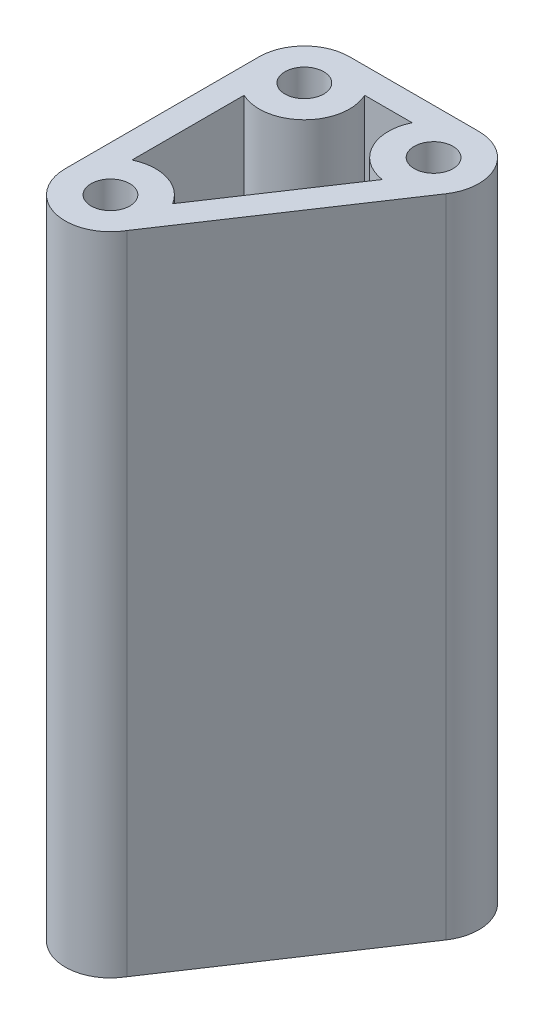
ISO-10303-21;
HEADER;
FILE_DESCRIPTION(('STEP AP214'),'2;1');
FILE_NAME('part.step','',(''),(''),'','','');
FILE_SCHEMA(('AUTOMOTIVE_DESIGN { 1 0 10303 214 1 1 1 1 }'));
ENDSEC;
DATA;
#1=APPLICATION_CONTEXT('core data for automotive mechanical design processes');
#2=APPLICATION_PROTOCOL_DEFINITION('international standard','automotive_design',2000,#1);
#3=PRODUCT_CONTEXT('',#1,'mechanical');
#4=PRODUCT('Part','Part','',(#3));
#5=PRODUCT_RELATED_PRODUCT_CATEGORY('part','',(#4));
#6=PRODUCT_DEFINITION_FORMATION('','',#4);
#7=PRODUCT_DEFINITION_CONTEXT('part definition',#1,'design');
#8=PRODUCT_DEFINITION('design','',#6,#7);
#9=PRODUCT_DEFINITION_SHAPE('','',#8);
#10=(LENGTH_UNIT() NAMED_UNIT(*) SI_UNIT(.MILLI.,.METRE.));
#11=(NAMED_UNIT(*) PLANE_ANGLE_UNIT() SI_UNIT($,.RADIAN.));
#12=(NAMED_UNIT(*) SI_UNIT($,.STERADIAN.) SOLID_ANGLE_UNIT());
#13=UNCERTAINTY_MEASURE_WITH_UNIT(LENGTH_MEASURE(1.E-05),#10,'distance_accuracy_value','');
#14=(GEOMETRIC_REPRESENTATION_CONTEXT(3) GLOBAL_UNCERTAINTY_ASSIGNED_CONTEXT((#13)) GLOBAL_UNIT_ASSIGNED_CONTEXT((#10,
#11,#12)) REPRESENTATION_CONTEXT('',''));
#15=CARTESIAN_POINT('',(0.,0.,0.));
#16=DIRECTION('',(0.,0.,1.));
#17=DIRECTION('',(1.,0.,0.));
#18=AXIS2_PLACEMENT_3D('',#15,#16,#17);
#19=CARTESIAN_POINT('',(-7.73602805423243,50.,-16.5521413639528));
#20=DIRECTION('',(0.,1.,0.));
#21=DIRECTION('',(0.,0.,1.));
#22=AXIS2_PLACEMENT_3D('',#19,#20,#21);
#23=PLANE('',#22);
#24=DIRECTION('',(0.,0.,1.));
#25=VECTOR('',#24,1.);
#26=CARTESIAN_POINT('',(-9.23602805423243,50.,-16.5521413639528));
#27=LINE('',#26,#25);
#28=CARTESIAN_POINT('',(-9.23602805423243,50.,-13.3898637037844));
#29=VERTEX_POINT('',#28);
#30=CARTESIAN_POINT('',(-9.23602805423243,50.,-4.71441902412118));
#31=VERTEX_POINT('',#30);
#32=EDGE_CURVE('E158',#29,#31,#27,.T.);
#33=ORIENTED_EDGE('',*,*,#32,.F.);
#34=CARTESIAN_POINT('',(-7.73602805423243,50.,-16.5521413639528));
#35=DIRECTION('',(0.,1.,0.));
#36=DIRECTION('',(0.,0.,1.));
#37=AXIS2_PLACEMENT_3D('',#34,#35,#36);
#38=CIRCLE('',#37,3.5);
#39=CARTESIAN_POINT('',(-4.57375039406405,50.,-18.0521413639528));
#40=VERTEX_POINT('',#39);
#41=EDGE_CURVE('E131',#29,#40,#38,.T.);
#42=ORIENTED_EDGE('',*,*,#41,.T.);
#43=DIRECTION('',(-1.,0.,0.));
#44=VECTOR('',#43,1.);
#45=CARTESIAN_POINT('',(-7.73602805423243,50.,-18.0521413639528));
#46=LINE('',#45,#44);
#47=CARTESIAN_POINT('',(-0.898305714400813,50.,-18.0521413639528));
#48=VERTEX_POINT('',#47);
#49=EDGE_CURVE('E58',#48,#40,#46,.T.);
#50=ORIENTED_EDGE('',*,*,#49,.F.);
#51=CARTESIAN_POINT('',(2.26397194576757,50.,-16.5521413639528));
#52=DIRECTION('',(0.,1.,0.));
#53=DIRECTION('',(0.,0.,1.));
#54=AXIS2_PLACEMENT_3D('',#51,#52,#53);
#55=CIRCLE('',#54,3.5);
#56=CARTESIAN_POINT('',(1.75650332997861,50.,-13.0891259721318));
#57=VERTEX_POINT('',#56);
#58=EDGE_CURVE('E165',#48,#57,#55,.T.);
#59=ORIENTED_EDGE('',*,*,#58,.T.);
#60=DIRECTION('',(0.555038453085446,0.,-0.831824690422517));
#61=VECTOR('',#60,1.);
#62=CARTESIAN_POINT('',(-6.36858852183192,50.,-0.912218270123703));
#63=LINE('',#62,#61);
#64=CARTESIAN_POINT('',(-4.73728886099812,50.,-3.35701345109927));
#65=VERTEX_POINT('',#64);
#66=EDGE_CURVE('E160',#65,#57,#63,.T.);
#67=ORIENTED_EDGE('',*,*,#66,.F.);
#68=CARTESIAN_POINT('',(-7.73602805423243,50.,-1.5521413639528));
#69=DIRECTION('',(0.,1.,0.));
#70=DIRECTION('',(0.,0.,1.));
#71=AXIS2_PLACEMENT_3D('',#68,#69,#70);
#72=CIRCLE('',#71,3.5);
#73=EDGE_CURVE('E157',#65,#31,#72,.T.);
#74=ORIENTED_EDGE('',*,*,#73,.T.);
#75=EDGE_LOOP('',(#33,#42,#50,#59,#67,#74));
#76=FACE_BOUND('',#75,.T.);
#77=CARTESIAN_POINT('',(2.26397194576757,50.,-16.5521413639528));
#78=DIRECTION('',(0.,1.,0.));
#79=DIRECTION('',(0.,0.,1.));
#80=AXIS2_PLACEMENT_3D('',#77,#78,#79);
#81=CIRCLE('',#80,1.5);
#82=CARTESIAN_POINT('',(2.26397194576757,50.,-15.0521413639528));
#83=VERTEX_POINT('',#82);
#84=EDGE_CURVE('E184',#83,#83,#81,.T.);
#85=ORIENTED_EDGE('',*,*,#84,.F.);
#86=EDGE_LOOP('',(#85));
#87=FACE_BOUND('',#86,.T.);
#88=CARTESIAN_POINT('',(-7.73602805423243,50.,-16.5521413639528));
#89=DIRECTION('',(0.,1.,0.));
#90=DIRECTION('',(0.,0.,1.));
#91=AXIS2_PLACEMENT_3D('',#88,#89,#90);
#92=CIRCLE('',#91,3.5);
#93=CARTESIAN_POINT('',(-7.73602805423243,50.,-20.0521413639528));
#94=VERTEX_POINT('',#93);
#95=CARTESIAN_POINT('',(-11.2360280542324,50.,-16.5521413639528));
#96=VERTEX_POINT('',#95);
#97=EDGE_CURVE('E196',#94,#96,#92,.T.);
#98=ORIENTED_EDGE('',*,*,#97,.T.);
#99=DIRECTION('',(0.,0.,1.));
#100=VECTOR('',#99,1.);
#101=CARTESIAN_POINT('',(-11.2360280542324,50.,-16.5521413639528));
#102=LINE('',#101,#100);
#103=CARTESIAN_POINT('',(-11.2360280542324,50.,-1.5521413639528));
#104=VERTEX_POINT('',#103);
#105=EDGE_CURVE('E199',#96,#104,#102,.T.);
#106=ORIENTED_EDGE('',*,*,#105,.T.);
#107=CARTESIAN_POINT('',(-7.73602805423243,50.,-1.5521413639528));
#108=DIRECTION('',(0.,1.,0.));
#109=DIRECTION('',(0.,0.,1.));
#110=AXIS2_PLACEMENT_3D('',#107,#108,#109);
#111=CIRCLE('',#110,3.5);
#112=CARTESIAN_POINT('',(-4.70493914098689,50.,0.197858636047188));
#113=VERTEX_POINT('',#112);
#114=EDGE_CURVE('E202',#104,#113,#111,.T.);
#115=ORIENTED_EDGE('',*,*,#114,.T.);
#116=DIRECTION('',(0.555038453085445,0.,-0.831824690422517));
#117=VECTOR('',#116,1.);
#118=CARTESIAN_POINT('',(-4.70493914098689,50.,0.197858636047188));
#119=LINE('',#118,#117);
#120=CARTESIAN_POINT('',(5.16907528644452,50.,-14.6001232851463));
#121=VERTEX_POINT('',#120);
#122=EDGE_CURVE('E204',#113,#121,#119,.T.);
#123=ORIENTED_EDGE('',*,*,#122,.T.);
#124=CARTESIAN_POINT('',(2.26397194576757,50.,-16.5521413639528));
#125=DIRECTION('',(0.,1.,0.));
#126=DIRECTION('',(0.,0.,1.));
#127=AXIS2_PLACEMENT_3D('',#124,#125,#126);
#128=CIRCLE('',#127,3.5);
#129=CARTESIAN_POINT('',(2.26397194576757,50.,-20.0521413639528));
#130=VERTEX_POINT('',#129);
#131=EDGE_CURVE('E206',#121,#130,#128,.T.);
#132=ORIENTED_EDGE('',*,*,#131,.T.);
#133=DIRECTION('',(-1.,0.,0.));
#134=VECTOR('',#133,1.);
#135=CARTESIAN_POINT('',(-7.73602805423243,50.,-20.0521413639528));
#136=LINE('',#135,#134);
#137=EDGE_CURVE('E208',#130,#94,#136,.T.);
#138=ORIENTED_EDGE('',*,*,#137,.T.);
#139=EDGE_LOOP('',(#98,#106,#115,#123,#132,#138));
#140=FACE_BOUND('',#139,.T.);
#141=CARTESIAN_POINT('',(-7.73602805423243,50.,-16.5521413639528));
#142=DIRECTION('',(0.,1.,0.));
#143=DIRECTION('',(0.,0.,1.));
#144=AXIS2_PLACEMENT_3D('',#141,#142,#143);
#145=CIRCLE('',#144,1.5);
#146=CARTESIAN_POINT('',(-7.73602805423243,50.,-15.0521413639528));
#147=VERTEX_POINT('',#146);
#148=EDGE_CURVE('E190',#147,#147,#145,.T.);
#149=ORIENTED_EDGE('',*,*,#148,.F.);
#150=EDGE_LOOP('',(#149));
#151=FACE_BOUND('',#150,.T.);
#152=CARTESIAN_POINT('',(-7.73602805423243,50.,-1.5521413639528));
#153=DIRECTION('',(0.,1.,0.));
#154=DIRECTION('',(0.,0.,1.));
#155=AXIS2_PLACEMENT_3D('',#152,#153,#154);
#156=CIRCLE('',#155,1.5);
#157=CARTESIAN_POINT('',(-7.73602805423243,50.,-0.0521413639528044));
#158=VERTEX_POINT('',#157);
#159=EDGE_CURVE('E178',#158,#158,#156,.T.);
#160=ORIENTED_EDGE('',*,*,#159,.F.);
#161=EDGE_LOOP('',(#160));
#162=FACE_BOUND('',#161,.T.);
#163=ADVANCED_FACE('F35',(#76,#87,#140,#151,#162),#23,.T.);
#164=CARTESIAN_POINT('',(-7.73602805423243,0.,-16.5521413639528));
#165=DIRECTION('',(0.,1.,0.));
#166=DIRECTION('',(0.,0.,1.));
#167=AXIS2_PLACEMENT_3D('',#164,#165,#166);
#168=PLANE('',#167);
#169=DIRECTION('',(-1.,0.,0.));
#170=VECTOR('',#169,1.);
#171=CARTESIAN_POINT('',(-4.57375039406405,0.,-18.0521413639528));
#172=LINE('',#171,#170);
#173=CARTESIAN_POINT('',(-0.898305714400811,0.,-18.0521413639528));
#174=VERTEX_POINT('',#173);
#175=CARTESIAN_POINT('',(-4.57375039406405,0.,-18.0521413639528));
#176=VERTEX_POINT('',#175);
#177=EDGE_CURVE('E147',#174,#176,#172,.T.);
#178=ORIENTED_EDGE('',*,*,#177,.T.);
#179=CARTESIAN_POINT('',(-7.73602805423243,0.,-16.5521413639528));
#180=DIRECTION('',(0.,-1.,0.));
#181=DIRECTION('',(0.,0.,-1.));
#182=AXIS2_PLACEMENT_3D('',#179,#180,#181);
#183=CIRCLE('',#182,3.5);
#184=CARTESIAN_POINT('',(-9.23602805423243,0.,-13.3898637037844));
#185=VERTEX_POINT('',#184);
#186=EDGE_CURVE('E128',#176,#185,#183,.T.);
#187=ORIENTED_EDGE('',*,*,#186,.T.);
#188=DIRECTION('',(0.,0.,1.));
#189=VECTOR('',#188,1.);
#190=CARTESIAN_POINT('',(-9.23602805423243,0.,-13.3898637037844));
#191=LINE('',#190,#189);
#192=CARTESIAN_POINT('',(-9.23602805423243,0.,-4.71441902412118));
#193=VERTEX_POINT('',#192);
#194=EDGE_CURVE('E137',#185,#193,#191,.T.);
#195=ORIENTED_EDGE('',*,*,#194,.T.);
#196=CARTESIAN_POINT('',(-7.73602805423243,0.,-1.5521413639528));
#197=DIRECTION('',(0.,-1.,0.));
#198=DIRECTION('',(0.,0.,-1.));
#199=AXIS2_PLACEMENT_3D('',#196,#197,#198);
#200=CIRCLE('',#199,3.5);
#201=CARTESIAN_POINT('',(-4.73728886099812,0.,-3.35701345109928));
#202=VERTEX_POINT('',#201);
#203=EDGE_CURVE('E141',#193,#202,#200,.T.);
#204=ORIENTED_EDGE('',*,*,#203,.T.);
#205=DIRECTION('',(0.555038453085445,0.,-0.831824690422517));
#206=VECTOR('',#205,1.);
#207=CARTESIAN_POINT('',(-4.73728886099812,0.,-3.35701345109927));
#208=LINE('',#207,#206);
#209=CARTESIAN_POINT('',(1.75650332997861,0.,-13.0891259721318));
#210=VERTEX_POINT('',#209);
#211=EDGE_CURVE('E151',#202,#210,#208,.T.);
#212=ORIENTED_EDGE('',*,*,#211,.T.);
#213=CARTESIAN_POINT('',(2.26397194576757,0.,-16.5521413639528));
#214=DIRECTION('',(0.,-1.,0.));
#215=DIRECTION('',(0.,0.,1.));
#216=AXIS2_PLACEMENT_3D('',#213,#214,#215);
#217=CIRCLE('',#216,3.5);
#218=EDGE_CURVE('E154',#210,#174,#217,.T.);
#219=ORIENTED_EDGE('',*,*,#218,.T.);
#220=EDGE_LOOP('',(#178,#187,#195,#204,#212,#219));
#221=FACE_BOUND('',#220,.T.);
#222=CARTESIAN_POINT('',(-7.73602805423243,0.,-16.5521413639528));
#223=DIRECTION('',(0.,1.,0.));
#224=DIRECTION('',(0.,0.,1.));
#225=AXIS2_PLACEMENT_3D('',#222,#223,#224);
#226=CIRCLE('',#225,3.5);
#227=CARTESIAN_POINT('',(-7.73602805423243,0.,-20.0521413639528));
#228=VERTEX_POINT('',#227);
#229=CARTESIAN_POINT('',(-11.2360280542324,0.,-16.5521413639528));
#230=VERTEX_POINT('',#229);
#231=EDGE_CURVE('E193',#228,#230,#226,.T.);
#232=ORIENTED_EDGE('',*,*,#231,.F.);
#233=DIRECTION('',(-1.,0.,0.));
#234=VECTOR('',#233,1.);
#235=CARTESIAN_POINT('',(-7.73602805423243,0.,-20.0521413639528));
#236=LINE('',#235,#234);
#237=CARTESIAN_POINT('',(2.26397194576757,0.,-20.0521413639528));
#238=VERTEX_POINT('',#237);
#239=EDGE_CURVE('E200',#238,#228,#236,.T.);
#240=ORIENTED_EDGE('',*,*,#239,.F.);
#241=CARTESIAN_POINT('',(2.26397194576757,0.,-16.5521413639528));
#242=DIRECTION('',(0.,1.,0.));
#243=DIRECTION('',(0.,0.,1.));
#244=AXIS2_PLACEMENT_3D('',#241,#242,#243);
#245=CIRCLE('',#244,3.5);
#246=CARTESIAN_POINT('',(5.16907528644452,0.,-14.6001232851463));
#247=VERTEX_POINT('',#246);
#248=EDGE_CURVE('E219',#247,#238,#245,.T.);
#249=ORIENTED_EDGE('',*,*,#248,.F.);
#250=DIRECTION('',(0.555038453085445,0.,-0.831824690422517));
#251=VECTOR('',#250,1.);
#252=CARTESIAN_POINT('',(-4.70493914098689,0.,0.197858636047188));
#253=LINE('',#252,#251);
#254=CARTESIAN_POINT('',(-4.70493914098689,0.,0.197858636047188));
#255=VERTEX_POINT('',#254);
#256=EDGE_CURVE('E217',#255,#247,#253,.T.);
#257=ORIENTED_EDGE('',*,*,#256,.F.);
#258=CARTESIAN_POINT('',(-7.73602805423243,0.,-1.5521413639528));
#259=DIRECTION('',(0.,1.,0.));
#260=DIRECTION('',(0.,0.,1.));
#261=AXIS2_PLACEMENT_3D('',#258,#259,#260);
#262=CIRCLE('',#261,3.5);
#263=CARTESIAN_POINT('',(-11.2360280542324,0.,-1.5521413639528));
#264=VERTEX_POINT('',#263);
#265=EDGE_CURVE('E215',#264,#255,#262,.T.);
#266=ORIENTED_EDGE('',*,*,#265,.F.);
#267=DIRECTION('',(0.,0.,1.));
#268=VECTOR('',#267,1.);
#269=CARTESIAN_POINT('',(-11.2360280542324,0.,-16.5521413639528));
#270=LINE('',#269,#268);
#271=EDGE_CURVE('E213',#230,#264,#270,.T.);
#272=ORIENTED_EDGE('',*,*,#271,.F.);
#273=EDGE_LOOP('',(#232,#240,#249,#257,#266,#272));
#274=FACE_BOUND('',#273,.T.);
#275=CARTESIAN_POINT('',(-7.73602805423243,0.,-16.5521413639528));
#276=DIRECTION('',(0.,1.,0.));
#277=DIRECTION('',(0.,0.,1.));
#278=AXIS2_PLACEMENT_3D('',#275,#276,#277);
#279=CIRCLE('',#278,1.5);
#280=CARTESIAN_POINT('',(-7.73602805423243,0.,-15.0521413639528));
#281=VERTEX_POINT('',#280);
#282=EDGE_CURVE('E187',#281,#281,#279,.T.);
#283=ORIENTED_EDGE('',*,*,#282,.T.);
#284=EDGE_LOOP('',(#283));
#285=FACE_BOUND('',#284,.T.);
#286=CARTESIAN_POINT('',(2.26397194576757,0.,-16.5521413639528));
#287=DIRECTION('',(0.,1.,0.));
#288=DIRECTION('',(0.,0.,1.));
#289=AXIS2_PLACEMENT_3D('',#286,#287,#288);
#290=CIRCLE('',#289,1.5);
#291=CARTESIAN_POINT('',(2.26397194576757,0.,-15.0521413639528));
#292=VERTEX_POINT('',#291);
#293=EDGE_CURVE('E181',#292,#292,#290,.T.);
#294=ORIENTED_EDGE('',*,*,#293,.T.);
#295=EDGE_LOOP('',(#294));
#296=FACE_BOUND('',#295,.T.);
#297=CARTESIAN_POINT('',(-7.73602805423243,0.,-1.5521413639528));
#298=DIRECTION('',(0.,1.,0.));
#299=DIRECTION('',(0.,0.,1.));
#300=AXIS2_PLACEMENT_3D('',#297,#298,#299);
#301=CIRCLE('',#300,1.5);
#302=CARTESIAN_POINT('',(-7.73602805423243,0.,-0.0521413639528044));
#303=VERTEX_POINT('',#302);
#304=EDGE_CURVE('E177',#303,#303,#301,.T.);
#305=ORIENTED_EDGE('',*,*,#304,.T.);
#306=EDGE_LOOP('',(#305));
#307=FACE_BOUND('',#306,.T.);
#308=ADVANCED_FACE('F143',(#221,#274,#285,#296,#307),#168,.F.);
#309=CARTESIAN_POINT('',(-7.73602805423243,50.,-16.5521413639528));
#310=DIRECTION('',(0.,-1.,0.));
#311=DIRECTION('',(0.,0.,-1.));
#312=AXIS2_PLACEMENT_3D('',#309,#310,#311);
#313=CYLINDRICAL_SURFACE('',#312,3.5);
#314=ORIENTED_EDGE('',*,*,#231,.T.);
#315=DIRECTION('',(0.,-1.,0.));
#316=VECTOR('',#315,1.);
#317=CARTESIAN_POINT('',(-11.2360280542324,50.,-16.5521413639528));
#318=LINE('',#317,#316);
#319=EDGE_CURVE('E11',#96,#230,#318,.T.);
#320=ORIENTED_EDGE('',*,*,#319,.F.);
#321=ORIENTED_EDGE('',*,*,#97,.F.);
#322=DIRECTION('',(0.,-1.,0.));
#323=VECTOR('',#322,1.);
#324=CARTESIAN_POINT('',(-7.73602805423243,50.,-20.0521413639528));
#325=LINE('',#324,#323);
#326=EDGE_CURVE('E210',#94,#228,#325,.T.);
#327=ORIENTED_EDGE('',*,*,#326,.T.);
#328=EDGE_LOOP('',(#314,#320,#321,#327));
#329=FACE_BOUND('',#328,.T.);
#330=ADVANCED_FACE('F37',(#329),#313,.T.);
#331=CARTESIAN_POINT('',(-11.2360280542324,50.,-16.5521413639528));
#332=DIRECTION('',(1.,0.,0.));
#333=DIRECTION('',(0.,0.,-1.));
#334=AXIS2_PLACEMENT_3D('',#331,#332,#333);
#335=PLANE('',#334);
#336=ORIENTED_EDGE('',*,*,#271,.T.);
#337=DIRECTION('',(0.,-1.,0.));
#338=VECTOR('',#337,1.);
#339=CARTESIAN_POINT('',(-11.2360280542324,50.,-1.5521413639528));
#340=LINE('',#339,#338);
#341=EDGE_CURVE('E43',#104,#264,#340,.T.);
#342=ORIENTED_EDGE('',*,*,#341,.F.);
#343=ORIENTED_EDGE('',*,*,#105,.F.);
#344=ORIENTED_EDGE('',*,*,#319,.T.);
#345=EDGE_LOOP('',(#336,#342,#343,#344));
#346=FACE_BOUND('',#345,.T.);
#347=ADVANCED_FACE('F259',(#346),#335,.F.);
#348=CARTESIAN_POINT('',(-7.73602805423243,50.,-1.5521413639528));
#349=DIRECTION('',(0.,-1.,0.));
#350=DIRECTION('',(0.,0.,-1.));
#351=AXIS2_PLACEMENT_3D('',#348,#349,#350);
#352=CYLINDRICAL_SURFACE('',#351,3.5);
#353=ORIENTED_EDGE('',*,*,#265,.T.);
#354=DIRECTION('',(0.,-1.,0.));
#355=VECTOR('',#354,1.);
#356=CARTESIAN_POINT('',(-4.70493914098689,50.,0.197858636047188));
#357=LINE('',#356,#355);
#358=EDGE_CURVE('E230',#113,#255,#357,.T.);
#359=ORIENTED_EDGE('',*,*,#358,.F.);
#360=ORIENTED_EDGE('',*,*,#114,.F.);
#361=ORIENTED_EDGE('',*,*,#341,.T.);
#362=EDGE_LOOP('',(#353,#359,#360,#361));
#363=FACE_BOUND('',#362,.T.);
#364=ADVANCED_FACE('F237',(#363),#352,.T.);
#365=CARTESIAN_POINT('',(-4.70493914098689,50.,0.197858636047188));
#366=DIRECTION('',(-0.831824690422517,0.,-0.555038453085446));
#367=DIRECTION('',(-0.555038453085446,0.,0.831824690422517));
#368=AXIS2_PLACEMENT_3D('',#365,#366,#367);
#369=PLANE('',#368);
#370=ORIENTED_EDGE('',*,*,#256,.T.);
#371=DIRECTION('',(0.,-1.,0.));
#372=VECTOR('',#371,1.);
#373=CARTESIAN_POINT('',(5.16907528644452,50.,-14.6001232851463));
#374=LINE('',#373,#372);
#375=EDGE_CURVE('E227',#121,#247,#374,.T.);
#376=ORIENTED_EDGE('',*,*,#375,.F.);
#377=ORIENTED_EDGE('',*,*,#122,.F.);
#378=ORIENTED_EDGE('',*,*,#358,.T.);
#379=EDGE_LOOP('',(#370,#376,#377,#378));
#380=FACE_BOUND('',#379,.T.);
#381=ADVANCED_FACE('F247',(#380),#369,.F.);
#382=CARTESIAN_POINT('',(2.26397194576757,50.,-16.5521413639528));
#383=DIRECTION('',(0.,-1.,0.));
#384=DIRECTION('',(0.,0.,-1.));
#385=AXIS2_PLACEMENT_3D('',#382,#383,#384);
#386=CYLINDRICAL_SURFACE('',#385,3.5);
#387=ORIENTED_EDGE('',*,*,#248,.T.);
#388=DIRECTION('',(0.,-1.,0.));
#389=VECTOR('',#388,1.);
#390=CARTESIAN_POINT('',(2.26397194576757,50.,-20.0521413639528));
#391=LINE('',#390,#389);
#392=EDGE_CURVE('E224',#130,#238,#391,.T.);
#393=ORIENTED_EDGE('',*,*,#392,.F.);
#394=ORIENTED_EDGE('',*,*,#131,.F.);
#395=ORIENTED_EDGE('',*,*,#375,.T.);
#396=EDGE_LOOP('',(#387,#393,#394,#395));
#397=FACE_BOUND('',#396,.T.);
#398=ADVANCED_FACE('F251',(#397),#386,.T.);
#399=CARTESIAN_POINT('',(-7.73602805423243,50.,-20.0521413639528));
#400=DIRECTION('',(0.,0.,1.));
#401=DIRECTION('',(1.,0.,0.));
#402=AXIS2_PLACEMENT_3D('',#399,#400,#401);
#403=PLANE('',#402);
#404=ORIENTED_EDGE('',*,*,#239,.T.);
#405=ORIENTED_EDGE('',*,*,#326,.F.);
#406=ORIENTED_EDGE('',*,*,#137,.F.);
#407=ORIENTED_EDGE('',*,*,#392,.T.);
#408=EDGE_LOOP('',(#404,#405,#406,#407));
#409=FACE_BOUND('',#408,.T.);
#410=ADVANCED_FACE('F262',(#409),#403,.F.);
#411=CARTESIAN_POINT('',(-7.73602805423243,50.,-16.5521413639528));
#412=DIRECTION('',(0.,-1.,0.));
#413=DIRECTION('',(0.,0.,-1.));
#414=AXIS2_PLACEMENT_3D('',#411,#412,#413);
#415=CYLINDRICAL_SURFACE('',#414,1.5);
#416=ORIENTED_EDGE('',*,*,#148,.T.);
#417=EDGE_LOOP('',(#416));
#418=FACE_BOUND('',#417,.T.);
#419=ORIENTED_EDGE('',*,*,#282,.F.);
#420=EDGE_LOOP('',(#419));
#421=FACE_BOUND('',#420,.T.);
#422=ADVANCED_FACE('F264',(#418,#421),#415,.F.);
#423=CARTESIAN_POINT('',(2.26397194576757,50.,-16.5521413639528));
#424=DIRECTION('',(0.,-1.,0.));
#425=DIRECTION('',(0.,0.,-1.));
#426=AXIS2_PLACEMENT_3D('',#423,#424,#425);
#427=CYLINDRICAL_SURFACE('',#426,1.5);
#428=ORIENTED_EDGE('',*,*,#84,.T.);
#429=EDGE_LOOP('',(#428));
#430=FACE_BOUND('',#429,.T.);
#431=ORIENTED_EDGE('',*,*,#293,.F.);
#432=EDGE_LOOP('',(#431));
#433=FACE_BOUND('',#432,.T.);
#434=ADVANCED_FACE('F270',(#430,#433),#427,.F.);
#435=CARTESIAN_POINT('',(-7.73602805423243,50.,-1.5521413639528));
#436=DIRECTION('',(0.,-1.,0.));
#437=DIRECTION('',(0.,0.,-1.));
#438=AXIS2_PLACEMENT_3D('',#435,#436,#437);
#439=CYLINDRICAL_SURFACE('',#438,1.5);
#440=ORIENTED_EDGE('',*,*,#159,.T.);
#441=EDGE_LOOP('',(#440));
#442=FACE_BOUND('',#441,.T.);
#443=ORIENTED_EDGE('',*,*,#304,.F.);
#444=EDGE_LOOP('',(#443));
#445=FACE_BOUND('',#444,.T.);
#446=ADVANCED_FACE('F286',(#442,#445),#439,.F.);
#447=CARTESIAN_POINT('',(-9.23602805423243,50.,-16.5521413639528));
#448=DIRECTION('',(1.,0.,0.));
#449=DIRECTION('',(0.,0.,-1.));
#450=AXIS2_PLACEMENT_3D('',#447,#448,#449);
#451=PLANE('',#450);
#452=DIRECTION('',(0.,-1.,0.));
#453=VECTOR('',#452,1.);
#454=CARTESIAN_POINT('',(-9.23602805423243,50.,-13.3898637037844));
#455=LINE('',#454,#453);
#456=EDGE_CURVE('E125',#185,#29,#455,.F.);
#457=ORIENTED_EDGE('',*,*,#456,.T.);
#458=ORIENTED_EDGE('',*,*,#32,.T.);
#459=DIRECTION('',(0.,-1.,0.));
#460=VECTOR('',#459,1.);
#461=CARTESIAN_POINT('',(-9.23602805423243,50.,-4.71441902412118));
#462=LINE('',#461,#460);
#463=EDGE_CURVE('E50',#193,#31,#462,.F.);
#464=ORIENTED_EDGE('',*,*,#463,.F.);
#465=ORIENTED_EDGE('',*,*,#194,.F.);
#466=EDGE_LOOP('',(#457,#458,#464,#465));
#467=FACE_BOUND('',#466,.T.);
#468=ADVANCED_FACE('F138',(#467),#451,.T.);
#469=CARTESIAN_POINT('',(-6.36858852183192,50.,-0.912218270123703));
#470=DIRECTION('',(-0.831824690422517,0.,-0.555038453085446));
#471=DIRECTION('',(-0.555038453085446,0.,0.831824690422517));
#472=AXIS2_PLACEMENT_3D('',#469,#470,#471);
#473=PLANE('',#472);
#474=DIRECTION('',(0.,-1.,0.));
#475=VECTOR('',#474,1.);
#476=CARTESIAN_POINT('',(1.75650332997861,50.,-13.0891259721318));
#477=LINE('',#476,#475);
#478=EDGE_CURVE('E133',#210,#57,#477,.F.);
#479=ORIENTED_EDGE('',*,*,#478,.F.);
#480=ORIENTED_EDGE('',*,*,#211,.F.);
#481=DIRECTION('',(0.,-1.,0.));
#482=VECTOR('',#481,1.);
#483=CARTESIAN_POINT('',(-4.73728886099812,50.,-3.35701345109927));
#484=LINE('',#483,#482);
#485=EDGE_CURVE('E171',#202,#65,#484,.F.);
#486=ORIENTED_EDGE('',*,*,#485,.T.);
#487=ORIENTED_EDGE('',*,*,#66,.T.);
#488=EDGE_LOOP('',(#479,#480,#486,#487));
#489=FACE_BOUND('',#488,.T.);
#490=ADVANCED_FACE('F304',(#489),#473,.T.);
#491=CARTESIAN_POINT('',(-7.73602805423243,50.,-18.0521413639528));
#492=DIRECTION('',(0.,0.,1.));
#493=DIRECTION('',(1.,0.,0.));
#494=AXIS2_PLACEMENT_3D('',#491,#492,#493);
#495=PLANE('',#494);
#496=DIRECTION('',(0.,-1.,0.));
#497=VECTOR('',#496,1.);
#498=CARTESIAN_POINT('',(-0.898305714400813,50.,-18.0521413639528));
#499=LINE('',#498,#497);
#500=EDGE_CURVE('E175',#174,#48,#499,.F.);
#501=ORIENTED_EDGE('',*,*,#500,.T.);
#502=ORIENTED_EDGE('',*,*,#49,.T.);
#503=DIRECTION('',(0.,-1.,0.));
#504=VECTOR('',#503,1.);
#505=CARTESIAN_POINT('',(-4.57375039406405,50.,-18.0521413639528));
#506=LINE('',#505,#504);
#507=EDGE_CURVE('E134',#176,#40,#506,.F.);
#508=ORIENTED_EDGE('',*,*,#507,.F.);
#509=ORIENTED_EDGE('',*,*,#177,.F.);
#510=EDGE_LOOP('',(#501,#502,#508,#509));
#511=FACE_BOUND('',#510,.T.);
#512=ADVANCED_FACE('F301',(#511),#495,.T.);
#513=CARTESIAN_POINT('',(-7.73602805423243,50.,-16.5521413639528));
#514=DIRECTION('',(0.,-1.,0.));
#515=DIRECTION('',(0.,0.,-1.));
#516=AXIS2_PLACEMENT_3D('',#513,#514,#515);
#517=CYLINDRICAL_SURFACE('',#516,3.5);
#518=ORIENTED_EDGE('',*,*,#456,.F.);
#519=ORIENTED_EDGE('',*,*,#186,.F.);
#520=ORIENTED_EDGE('',*,*,#507,.T.);
#521=ORIENTED_EDGE('',*,*,#41,.F.);
#522=EDGE_LOOP('',(#518,#519,#520,#521));
#523=FACE_BOUND('',#522,.T.);
#524=ADVANCED_FACE('F126',(#523),#517,.T.);
#525=CARTESIAN_POINT('',(2.26397194576757,50.,-16.5521413639528));
#526=DIRECTION('',(0.,-1.,0.));
#527=DIRECTION('',(0.,0.,-1.));
#528=AXIS2_PLACEMENT_3D('',#525,#526,#527);
#529=CYLINDRICAL_SURFACE('',#528,3.5);
#530=ORIENTED_EDGE('',*,*,#500,.F.);
#531=ORIENTED_EDGE('',*,*,#218,.F.);
#532=ORIENTED_EDGE('',*,*,#478,.T.);
#533=ORIENTED_EDGE('',*,*,#58,.F.);
#534=EDGE_LOOP('',(#530,#531,#532,#533));
#535=FACE_BOUND('',#534,.T.);
#536=ADVANCED_FACE('F294',(#535),#529,.T.);
#537=CARTESIAN_POINT('',(-7.73602805423243,50.,-1.5521413639528));
#538=DIRECTION('',(0.,-1.,0.));
#539=DIRECTION('',(0.,0.,-1.));
#540=AXIS2_PLACEMENT_3D('',#537,#538,#539);
#541=CYLINDRICAL_SURFACE('',#540,3.5);
#542=ORIENTED_EDGE('',*,*,#485,.F.);
#543=ORIENTED_EDGE('',*,*,#203,.F.);
#544=ORIENTED_EDGE('',*,*,#463,.T.);
#545=ORIENTED_EDGE('',*,*,#73,.F.);
#546=EDGE_LOOP('',(#542,#543,#544,#545));
#547=FACE_BOUND('',#546,.T.);
#548=ADVANCED_FACE('F291',(#547),#541,.T.);
#549=CLOSED_SHELL('',(#163,#308,#330,#347,#364,#381,#398,#410,#422,#434,#446,#468,#490,#512,
#524,#536,#548));
#550=MANIFOLD_SOLID_BREP('B2',#549);
#551=ADVANCED_BREP_SHAPE_REPRESENTATION('',(#18,#550),#14);
#552=SHAPE_DEFINITION_REPRESENTATION(#9,#551);
ENDSEC;
END-ISO-10303-21;
